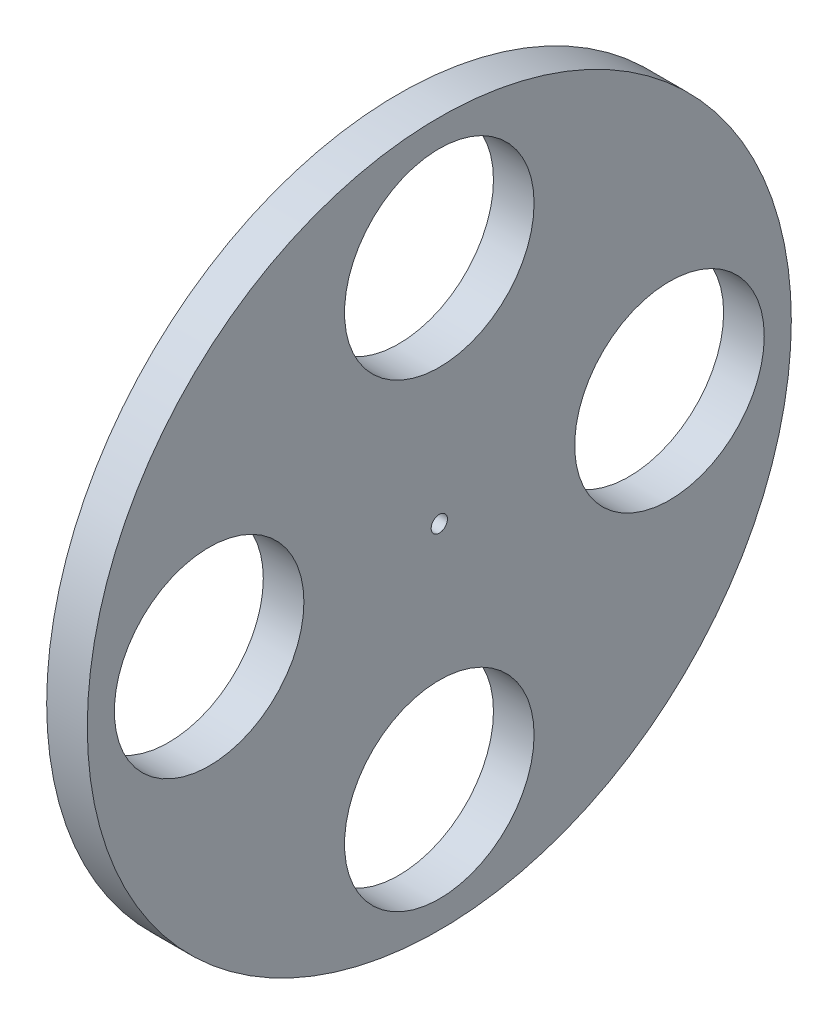
ISO-10303-21;
HEADER;
FILE_DESCRIPTION(('STEP AP214'),'2;1');
FILE_NAME('part.step','',(''),(''),'','','');
FILE_SCHEMA(('AUTOMOTIVE_DESIGN { 1 0 10303 214 1 1 1 1 }'));
ENDSEC;
DATA;
#1=APPLICATION_CONTEXT('core data for automotive mechanical design processes');
#2=APPLICATION_PROTOCOL_DEFINITION('international standard','automotive_design',2000,#1);
#3=PRODUCT_CONTEXT('',#1,'mechanical');
#4=PRODUCT('Part','Part','',(#3));
#5=PRODUCT_RELATED_PRODUCT_CATEGORY('part','',(#4));
#6=PRODUCT_DEFINITION_FORMATION('','',#4);
#7=PRODUCT_DEFINITION_CONTEXT('part definition',#1,'design');
#8=PRODUCT_DEFINITION('design','',#6,#7);
#9=PRODUCT_DEFINITION_SHAPE('','',#8);
#10=(LENGTH_UNIT() NAMED_UNIT(*) SI_UNIT(.MILLI.,.METRE.));
#11=(NAMED_UNIT(*) PLANE_ANGLE_UNIT() SI_UNIT($,.RADIAN.));
#12=(NAMED_UNIT(*) SI_UNIT($,.STERADIAN.) SOLID_ANGLE_UNIT());
#13=UNCERTAINTY_MEASURE_WITH_UNIT(LENGTH_MEASURE(1.E-05),#10,'distance_accuracy_value','');
#14=(GEOMETRIC_REPRESENTATION_CONTEXT(3) GLOBAL_UNCERTAINTY_ASSIGNED_CONTEXT((#13)) GLOBAL_UNIT_ASSIGNED_CONTEXT((#10,
#11,#12)) REPRESENTATION_CONTEXT('',''));
#15=CARTESIAN_POINT('',(0.,0.,0.));
#16=DIRECTION('',(0.,0.,1.));
#17=DIRECTION('',(1.,0.,0.));
#18=AXIS2_PLACEMENT_3D('',#15,#16,#17);
#19=CARTESIAN_POINT('',(15.,0.,0.));
#20=DIRECTION('',(-1.,0.,0.));
#21=DIRECTION('',(0.,0.,1.));
#22=AXIS2_PLACEMENT_3D('',#19,#20,#21);
#23=CYLINDRICAL_SURFACE('',#22,130.);
#24=CARTESIAN_POINT('',(15.,0.,0.));
#25=DIRECTION('',(1.,0.,0.));
#26=DIRECTION('',(0.,0.,-1.));
#27=AXIS2_PLACEMENT_3D('',#24,#25,#26);
#28=CIRCLE('',#27,130.);
#29=CARTESIAN_POINT('',(15.,0.,-130.));
#30=VERTEX_POINT('',#29);
#31=EDGE_CURVE('E10',#30,#30,#28,.T.);
#32=ORIENTED_EDGE('',*,*,#31,.F.);
#33=EDGE_LOOP('',(#32));
#34=FACE_BOUND('',#33,.T.);
#35=CARTESIAN_POINT('',(0.,0.,0.));
#36=DIRECTION('',(1.,0.,0.));
#37=DIRECTION('',(0.,0.,-1.));
#38=AXIS2_PLACEMENT_3D('',#35,#36,#37);
#39=CIRCLE('',#38,130.);
#40=CARTESIAN_POINT('',(0.,0.,-130.));
#41=VERTEX_POINT('',#40);
#42=EDGE_CURVE('E40',#41,#41,#39,.T.);
#43=ORIENTED_EDGE('',*,*,#42,.T.);
#44=EDGE_LOOP('',(#43));
#45=FACE_BOUND('',#44,.T.);
#46=ADVANCED_FACE('F33',(#34,#45),#23,.T.);
#47=CARTESIAN_POINT('',(15.,0.,0.));
#48=DIRECTION('',(1.,0.,0.));
#49=DIRECTION('',(0.,0.,-1.));
#50=AXIS2_PLACEMENT_3D('',#47,#48,#49);
#51=PLANE('',#50);
#52=CARTESIAN_POINT('',(15.,0.,0.));
#53=DIRECTION('',(1.,0.,0.));
#54=DIRECTION('',(0.,0.,-1.));
#55=AXIS2_PLACEMENT_3D('',#52,#53,#54);
#56=CIRCLE('',#55,3.);
#57=CARTESIAN_POINT('',(15.,0.,-3.));
#58=VERTEX_POINT('',#57);
#59=EDGE_CURVE('E70',#58,#58,#56,.T.);
#60=ORIENTED_EDGE('',*,*,#59,.F.);
#61=EDGE_LOOP('',(#60));
#62=FACE_BOUND('',#61,.T.);
#63=CARTESIAN_POINT('',(15.,85.,0.));
#64=DIRECTION('',(1.,0.,0.));
#65=DIRECTION('',(0.,0.,-1.));
#66=AXIS2_PLACEMENT_3D('',#63,#64,#65);
#67=CIRCLE('',#66,35.);
#68=CARTESIAN_POINT('',(15.,85.,-35.));
#69=VERTEX_POINT('',#68);
#70=EDGE_CURVE('E65',#69,#69,#67,.T.);
#71=ORIENTED_EDGE('',*,*,#70,.F.);
#72=EDGE_LOOP('',(#71));
#73=FACE_BOUND('',#72,.T.);
#74=CARTESIAN_POINT('',(15.,0.,-85.));
#75=DIRECTION('',(1.,0.,0.));
#76=DIRECTION('',(0.,0.,-1.));
#77=AXIS2_PLACEMENT_3D('',#74,#75,#76);
#78=CIRCLE('',#77,35.);
#79=CARTESIAN_POINT('',(15.,0.,-120.));
#80=VERTEX_POINT('',#79);
#81=EDGE_CURVE('E59',#80,#80,#78,.T.);
#82=ORIENTED_EDGE('',*,*,#81,.F.);
#83=EDGE_LOOP('',(#82));
#84=FACE_BOUND('',#83,.T.);
#85=CARTESIAN_POINT('',(15.,-85.,0.));
#86=DIRECTION('',(1.,0.,0.));
#87=DIRECTION('',(0.,0.,-1.));
#88=AXIS2_PLACEMENT_3D('',#85,#86,#87);
#89=CIRCLE('',#88,35.);
#90=CARTESIAN_POINT('',(15.,-85.,-35.));
#91=VERTEX_POINT('',#90);
#92=EDGE_CURVE('E53',#91,#91,#89,.T.);
#93=ORIENTED_EDGE('',*,*,#92,.F.);
#94=EDGE_LOOP('',(#93));
#95=FACE_BOUND('',#94,.T.);
#96=CARTESIAN_POINT('',(15.,0.,85.));
#97=DIRECTION('',(1.,0.,0.));
#98=DIRECTION('',(0.,0.,-1.));
#99=AXIS2_PLACEMENT_3D('',#96,#97,#98);
#100=CIRCLE('',#99,35.);
#101=CARTESIAN_POINT('',(15.,0.,50.));
#102=VERTEX_POINT('',#101);
#103=EDGE_CURVE('E47',#102,#102,#100,.T.);
#104=ORIENTED_EDGE('',*,*,#103,.F.);
#105=EDGE_LOOP('',(#104));
#106=FACE_BOUND('',#105,.T.);
#107=ORIENTED_EDGE('',*,*,#31,.T.);
#108=EDGE_LOOP('',(#107));
#109=FACE_BOUND('',#108,.T.);
#110=ADVANCED_FACE('F91',(#62,#73,#84,#95,#106,#109),#51,.T.);
#111=CARTESIAN_POINT('',(0.,0.,0.));
#112=DIRECTION('',(1.,0.,0.));
#113=DIRECTION('',(0.,0.,-1.));
#114=AXIS2_PLACEMENT_3D('',#111,#112,#113);
#115=PLANE('',#114);
#116=CARTESIAN_POINT('',(0.,0.,0.));
#117=DIRECTION('',(1.,0.,0.));
#118=DIRECTION('',(0.,0.,-1.));
#119=AXIS2_PLACEMENT_3D('',#116,#117,#118);
#120=CIRCLE('',#119,3.);
#121=CARTESIAN_POINT('',(0.,0.,-3.));
#122=VERTEX_POINT('',#121);
#123=EDGE_CURVE('E36',#122,#122,#120,.T.);
#124=ORIENTED_EDGE('',*,*,#123,.T.);
#125=EDGE_LOOP('',(#124));
#126=FACE_BOUND('',#125,.T.);
#127=CARTESIAN_POINT('',(0.,85.,0.));
#128=DIRECTION('',(1.,0.,0.));
#129=DIRECTION('',(0.,0.,-1.));
#130=AXIS2_PLACEMENT_3D('',#127,#128,#129);
#131=CIRCLE('',#130,35.);
#132=CARTESIAN_POINT('',(0.,85.,-35.));
#133=VERTEX_POINT('',#132);
#134=EDGE_CURVE('E45',#133,#133,#131,.T.);
#135=ORIENTED_EDGE('',*,*,#134,.T.);
#136=EDGE_LOOP('',(#135));
#137=FACE_BOUND('',#136,.T.);
#138=CARTESIAN_POINT('',(0.,0.,-85.));
#139=DIRECTION('',(1.,0.,0.));
#140=DIRECTION('',(0.,0.,-1.));
#141=AXIS2_PLACEMENT_3D('',#138,#139,#140);
#142=CIRCLE('',#141,35.);
#143=CARTESIAN_POINT('',(0.,0.,-120.));
#144=VERTEX_POINT('',#143);
#145=EDGE_CURVE('E62',#144,#144,#142,.T.);
#146=ORIENTED_EDGE('',*,*,#145,.T.);
#147=EDGE_LOOP('',(#146));
#148=FACE_BOUND('',#147,.T.);
#149=CARTESIAN_POINT('',(0.,-85.,0.));
#150=DIRECTION('',(1.,0.,0.));
#151=DIRECTION('',(0.,0.,-1.));
#152=AXIS2_PLACEMENT_3D('',#149,#150,#151);
#153=CIRCLE('',#152,35.);
#154=CARTESIAN_POINT('',(0.,-85.,-35.));
#155=VERTEX_POINT('',#154);
#156=EDGE_CURVE('E56',#155,#155,#153,.T.);
#157=ORIENTED_EDGE('',*,*,#156,.T.);
#158=EDGE_LOOP('',(#157));
#159=FACE_BOUND('',#158,.T.);
#160=CARTESIAN_POINT('',(0.,0.,85.));
#161=DIRECTION('',(1.,0.,0.));
#162=DIRECTION('',(0.,0.,-1.));
#163=AXIS2_PLACEMENT_3D('',#160,#161,#162);
#164=CIRCLE('',#163,35.);
#165=CARTESIAN_POINT('',(0.,0.,50.));
#166=VERTEX_POINT('',#165);
#167=EDGE_CURVE('E50',#166,#166,#164,.T.);
#168=ORIENTED_EDGE('',*,*,#167,.T.);
#169=EDGE_LOOP('',(#168));
#170=FACE_BOUND('',#169,.T.);
#171=ORIENTED_EDGE('',*,*,#42,.F.);
#172=EDGE_LOOP('',(#171));
#173=FACE_BOUND('',#172,.T.);
#174=ADVANCED_FACE('F77',(#126,#137,#148,#159,#170,#173),#115,.F.);
#175=CARTESIAN_POINT('',(0.,0.,85.));
#176=DIRECTION('',(1.,0.,0.));
#177=DIRECTION('',(0.,0.,-1.));
#178=AXIS2_PLACEMENT_3D('',#175,#176,#177);
#179=CYLINDRICAL_SURFACE('',#178,35.);
#180=ORIENTED_EDGE('',*,*,#167,.F.);
#181=EDGE_LOOP('',(#180));
#182=FACE_BOUND('',#181,.T.);
#183=ORIENTED_EDGE('',*,*,#103,.T.);
#184=EDGE_LOOP('',(#183));
#185=FACE_BOUND('',#184,.T.);
#186=ADVANCED_FACE('F102',(#182,#185),#179,.F.);
#187=CARTESIAN_POINT('',(0.,-85.,0.));
#188=DIRECTION('',(1.,0.,0.));
#189=DIRECTION('',(0.,0.,-1.));
#190=AXIS2_PLACEMENT_3D('',#187,#188,#189);
#191=CYLINDRICAL_SURFACE('',#190,35.);
#192=ORIENTED_EDGE('',*,*,#156,.F.);
#193=EDGE_LOOP('',(#192));
#194=FACE_BOUND('',#193,.T.);
#195=ORIENTED_EDGE('',*,*,#92,.T.);
#196=EDGE_LOOP('',(#195));
#197=FACE_BOUND('',#196,.T.);
#198=ADVANCED_FACE('F106',(#194,#197),#191,.F.);
#199=CARTESIAN_POINT('',(0.,0.,-85.));
#200=DIRECTION('',(1.,0.,0.));
#201=DIRECTION('',(0.,0.,-1.));
#202=AXIS2_PLACEMENT_3D('',#199,#200,#201);
#203=CYLINDRICAL_SURFACE('',#202,35.);
#204=ORIENTED_EDGE('',*,*,#145,.F.);
#205=EDGE_LOOP('',(#204));
#206=FACE_BOUND('',#205,.T.);
#207=ORIENTED_EDGE('',*,*,#81,.T.);
#208=EDGE_LOOP('',(#207));
#209=FACE_BOUND('',#208,.T.);
#210=ADVANCED_FACE('F87',(#206,#209),#203,.F.);
#211=CARTESIAN_POINT('',(0.,85.,0.));
#212=DIRECTION('',(1.,0.,0.));
#213=DIRECTION('',(0.,0.,-1.));
#214=AXIS2_PLACEMENT_3D('',#211,#212,#213);
#215=CYLINDRICAL_SURFACE('',#214,35.);
#216=ORIENTED_EDGE('',*,*,#134,.F.);
#217=EDGE_LOOP('',(#216));
#218=FACE_BOUND('',#217,.T.);
#219=ORIENTED_EDGE('',*,*,#70,.T.);
#220=EDGE_LOOP('',(#219));
#221=FACE_BOUND('',#220,.T.);
#222=ADVANCED_FACE('F82',(#218,#221),#215,.F.);
#223=CARTESIAN_POINT('',(-9.,0.,0.));
#224=DIRECTION('',(1.,0.,0.));
#225=DIRECTION('',(0.,0.,-1.));
#226=AXIS2_PLACEMENT_3D('',#223,#224,#225);
#227=CYLINDRICAL_SURFACE('',#226,3.);
#228=ORIENTED_EDGE('',*,*,#59,.T.);
#229=EDGE_LOOP('',(#228));
#230=FACE_BOUND('',#229,.T.);
#231=ORIENTED_EDGE('',*,*,#123,.F.);
#232=EDGE_LOOP('',(#231));
#233=FACE_BOUND('',#232,.T.);
#234=ADVANCED_FACE('F80',(#230,#233),#227,.F.);
#235=CLOSED_SHELL('',(#46,#110,#174,#186,#198,#210,#222,#234));
#236=MANIFOLD_SOLID_BREP('B2',#235);
#237=ADVANCED_BREP_SHAPE_REPRESENTATION('',(#18,#236),#14);
#238=SHAPE_DEFINITION_REPRESENTATION(#9,#237);
ENDSEC;
END-ISO-10303-21;
